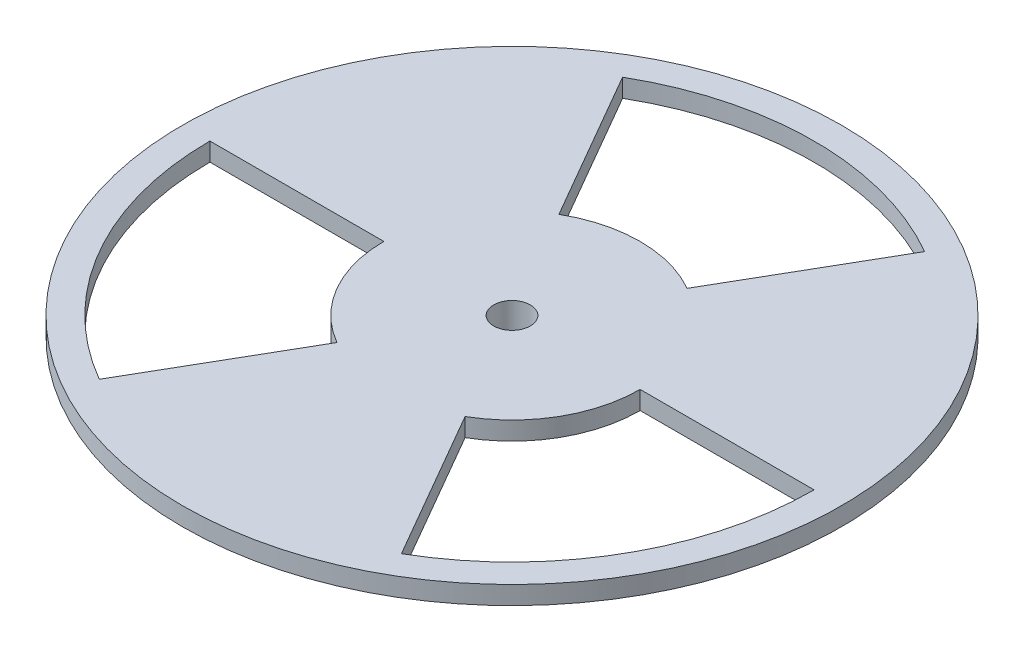
ISO-10303-21;
HEADER;
FILE_DESCRIPTION(('STEP AP214'),'2;1');
FILE_NAME('part.step','',(''),(''),'','','');
FILE_SCHEMA(('AUTOMOTIVE_DESIGN { 1 0 10303 214 1 1 1 1 }'));
ENDSEC;
DATA;
#1=APPLICATION_CONTEXT('core data for automotive mechanical design processes');
#2=APPLICATION_PROTOCOL_DEFINITION('international standard','automotive_design',2000,#1);
#3=PRODUCT_CONTEXT('',#1,'mechanical');
#4=PRODUCT('Part','Part','',(#3));
#5=PRODUCT_RELATED_PRODUCT_CATEGORY('part','',(#4));
#6=PRODUCT_DEFINITION_FORMATION('','',#4);
#7=PRODUCT_DEFINITION_CONTEXT('part definition',#1,'design');
#8=PRODUCT_DEFINITION('design','',#6,#7);
#9=PRODUCT_DEFINITION_SHAPE('','',#8);
#10=(LENGTH_UNIT() NAMED_UNIT(*) SI_UNIT(.MILLI.,.METRE.));
#11=(NAMED_UNIT(*) PLANE_ANGLE_UNIT() SI_UNIT($,.RADIAN.));
#12=(NAMED_UNIT(*) SI_UNIT($,.STERADIAN.) SOLID_ANGLE_UNIT());
#13=UNCERTAINTY_MEASURE_WITH_UNIT(LENGTH_MEASURE(1.E-05),#10,'distance_accuracy_value','');
#14=(GEOMETRIC_REPRESENTATION_CONTEXT(3) GLOBAL_UNCERTAINTY_ASSIGNED_CONTEXT((#13)) GLOBAL_UNIT_ASSIGNED_CONTEXT((#10,
#11,#12)) REPRESENTATION_CONTEXT('',''));
#15=CARTESIAN_POINT('',(0.,0.,0.));
#16=DIRECTION('',(0.,0.,1.));
#17=DIRECTION('',(1.,0.,0.));
#18=AXIS2_PLACEMENT_3D('',#15,#16,#17);
#19=CARTESIAN_POINT('',(0.,1.,0.));
#20=DIRECTION('',(0.,-1.,0.));
#21=DIRECTION('',(0.,0.,-1.));
#22=AXIS2_PLACEMENT_3D('',#19,#20,#21);
#23=CYLINDRICAL_SURFACE('',#22,18.);
#24=CARTESIAN_POINT('',(0.,1.,0.));
#25=DIRECTION('',(0.,1.,0.));
#26=DIRECTION('',(0.,0.,1.));
#27=AXIS2_PLACEMENT_3D('',#24,#25,#26);
#28=CIRCLE('',#27,18.);
#29=CARTESIAN_POINT('',(0.,1.,18.));
#30=VERTEX_POINT('',#29);
#31=EDGE_CURVE('E46',#30,#30,#28,.T.);
#32=ORIENTED_EDGE('',*,*,#31,.F.);
#33=EDGE_LOOP('',(#32));
#34=FACE_BOUND('',#33,.T.);
#35=CARTESIAN_POINT('',(0.,0.,0.));
#36=DIRECTION('',(0.,1.,0.));
#37=DIRECTION('',(0.,0.,1.));
#38=AXIS2_PLACEMENT_3D('',#35,#36,#37);
#39=CIRCLE('',#38,18.);
#40=CARTESIAN_POINT('',(0.,0.,18.));
#41=VERTEX_POINT('',#40);
#42=EDGE_CURVE('E273',#41,#41,#39,.T.);
#43=ORIENTED_EDGE('',*,*,#42,.T.);
#44=EDGE_LOOP('',(#43));
#45=FACE_BOUND('',#44,.T.);
#46=ADVANCED_FACE('F38',(#34,#45),#23,.T.);
#47=CARTESIAN_POINT('',(0.,1.,0.));
#48=DIRECTION('',(0.,1.,0.));
#49=DIRECTION('',(0.,0.,1.));
#50=AXIS2_PLACEMENT_3D('',#47,#48,#49);
#51=PLANE('',#50);
#52=CARTESIAN_POINT('',(0.,1.,0.));
#53=DIRECTION('',(0.,1.,0.));
#54=DIRECTION('',(0.,0.,-1.));
#55=AXIS2_PLACEMENT_3D('',#52,#53,#54);
#56=CIRCLE('',#55,16.5);
#57=CARTESIAN_POINT('',(8.25000000000002,1.,-14.2894191624432));
#58=VERTEX_POINT('',#57);
#59=CARTESIAN_POINT('',(-8.25000000000002,1.,-14.2894191624432));
#60=VERTEX_POINT('',#59);
#61=EDGE_CURVE('E53',#58,#60,#56,.T.);
#62=ORIENTED_EDGE('',*,*,#61,.F.);
#63=DIRECTION('',(0.500000000000001,0.,-0.866025403784438));
#64=VECTOR('',#63,1.);
#65=CARTESIAN_POINT('',(3.50000000000001,1.,-6.06217782649107));
#66=LINE('',#65,#64);
#67=CARTESIAN_POINT('',(3.50000000000001,1.,-6.06217782649107));
#68=VERTEX_POINT('',#67);
#69=EDGE_CURVE('E136',#68,#58,#66,.T.);
#70=ORIENTED_EDGE('',*,*,#69,.F.);
#71=CARTESIAN_POINT('',(0.,1.,0.));
#72=DIRECTION('',(0.,-1.,0.));
#73=DIRECTION('',(0.,0.,-1.));
#74=AXIS2_PLACEMENT_3D('',#71,#72,#73);
#75=CIRCLE('',#74,7.);
#76=CARTESIAN_POINT('',(-3.50000000000001,1.,-6.06217782649107));
#77=VERTEX_POINT('',#76);
#78=EDGE_CURVE('E164',#77,#68,#75,.T.);
#79=ORIENTED_EDGE('',*,*,#78,.F.);
#80=DIRECTION('',(0.500000000000001,0.,0.866025403784438));
#81=VECTOR('',#80,1.);
#82=CARTESIAN_POINT('',(-3.50000000000001,1.,-6.06217782649107));
#83=LINE('',#82,#81);
#84=EDGE_CURVE('E156',#60,#77,#83,.T.);
#85=ORIENTED_EDGE('',*,*,#84,.F.);
#86=EDGE_LOOP('',(#62,#70,#79,#85));
#87=FACE_BOUND('',#86,.T.);
#88=CARTESIAN_POINT('',(0.,1.,0.));
#89=DIRECTION('',(0.,1.,0.));
#90=DIRECTION('',(0.,0.,-1.));
#91=AXIS2_PLACEMENT_3D('',#88,#89,#90);
#92=CIRCLE('',#91,16.5);
#93=CARTESIAN_POINT('',(8.24999999999991,1.,14.2894191624433));
#94=VERTEX_POINT('',#93);
#95=CARTESIAN_POINT('',(16.5,1.,0.));
#96=VERTEX_POINT('',#95);
#97=EDGE_CURVE('E61',#94,#96,#92,.T.);
#98=ORIENTED_EDGE('',*,*,#97,.F.);
#99=DIRECTION('',(0.499999999999995,0.,0.866025403784442));
#100=VECTOR('',#99,1.);
#101=CARTESIAN_POINT('',(3.49999999999996,1.,6.06217782649109));
#102=LINE('',#101,#100);
#103=CARTESIAN_POINT('',(3.49999999999996,1.,6.06217782649109));
#104=VERTEX_POINT('',#103);
#105=EDGE_CURVE('E200',#104,#94,#102,.T.);
#106=ORIENTED_EDGE('',*,*,#105,.F.);
#107=CARTESIAN_POINT('',(0.,1.,0.));
#108=DIRECTION('',(0.,-1.,0.));
#109=DIRECTION('',(0.,0.,-1.));
#110=AXIS2_PLACEMENT_3D('',#107,#108,#109);
#111=CIRCLE('',#110,7.);
#112=CARTESIAN_POINT('',(7.,1.,0.));
#113=VERTEX_POINT('',#112);
#114=EDGE_CURVE('E196',#113,#104,#111,.T.);
#115=ORIENTED_EDGE('',*,*,#114,.F.);
#116=DIRECTION('',(-1.,0.,0.));
#117=VECTOR('',#116,1.);
#118=CARTESIAN_POINT('',(7.,1.,0.));
#119=LINE('',#118,#117);
#120=EDGE_CURVE('E192',#96,#113,#119,.T.);
#121=ORIENTED_EDGE('',*,*,#120,.F.);
#122=EDGE_LOOP('',(#98,#106,#115,#121));
#123=FACE_BOUND('',#122,.T.);
#124=CARTESIAN_POINT('',(0.,1.,0.));
#125=DIRECTION('',(0.,1.,0.));
#126=DIRECTION('',(0.,0.,-1.));
#127=AXIS2_PLACEMENT_3D('',#124,#125,#126);
#128=CIRCLE('',#127,16.5);
#129=CARTESIAN_POINT('',(-16.5,1.,-1.72604985859692E-13));
#130=VERTEX_POINT('',#129);
#131=CARTESIAN_POINT('',(-8.25000000000012,1.,14.2894191624432));
#132=VERTEX_POINT('',#131);
#133=EDGE_CURVE('E231',#130,#132,#128,.T.);
#134=ORIENTED_EDGE('',*,*,#133,.F.);
#135=DIRECTION('',(-1.,0.,0.));
#136=VECTOR('',#135,1.);
#137=CARTESIAN_POINT('',(-7.,1.,0.));
#138=LINE('',#137,#136);
#139=CARTESIAN_POINT('',(-7.,1.,0.));
#140=VERTEX_POINT('',#139);
#141=EDGE_CURVE('E242',#140,#130,#138,.T.);
#142=ORIENTED_EDGE('',*,*,#141,.F.);
#143=CARTESIAN_POINT('',(0.,1.,0.));
#144=DIRECTION('',(0.,-1.,0.));
#145=DIRECTION('',(0.,0.,-1.));
#146=AXIS2_PLACEMENT_3D('',#143,#144,#145);
#147=CIRCLE('',#146,7.);
#148=CARTESIAN_POINT('',(-3.50000000000005,1.,6.06217782649104));
#149=VERTEX_POINT('',#148);
#150=EDGE_CURVE('E238',#149,#140,#147,.T.);
#151=ORIENTED_EDGE('',*,*,#150,.F.);
#152=DIRECTION('',(0.500000000000007,0.,-0.866025403784435));
#153=VECTOR('',#152,1.);
#154=CARTESIAN_POINT('',(-3.50000000000005,1.,6.06217782649104));
#155=LINE('',#154,#153);
#156=EDGE_CURVE('E234',#132,#149,#155,.T.);
#157=ORIENTED_EDGE('',*,*,#156,.F.);
#158=EDGE_LOOP('',(#134,#142,#151,#157));
#159=FACE_BOUND('',#158,.T.);
#160=CARTESIAN_POINT('',(0.,1.,0.));
#161=DIRECTION('',(0.,-1.,0.));
#162=DIRECTION('',(0.,0.,-1.));
#163=AXIS2_PLACEMENT_3D('',#160,#161,#162);
#164=CIRCLE('',#163,1.);
#165=CARTESIAN_POINT('',(0.,1.,-1.));
#166=VERTEX_POINT('',#165);
#167=EDGE_CURVE('E262',#166,#166,#164,.T.);
#168=ORIENTED_EDGE('',*,*,#167,.T.);
#169=EDGE_LOOP('',(#168));
#170=FACE_BOUND('',#169,.T.);
#171=ORIENTED_EDGE('',*,*,#31,.T.);
#172=EDGE_LOOP('',(#171));
#173=FACE_BOUND('',#172,.T.);
#174=ADVANCED_FACE('F283',(#87,#123,#159,#170,#173),#51,.T.);
#175=CARTESIAN_POINT('',(0.,0.,0.));
#176=DIRECTION('',(0.,1.,0.));
#177=DIRECTION('',(0.,0.,1.));
#178=AXIS2_PLACEMENT_3D('',#175,#176,#177);
#179=PLANE('',#178);
#180=DIRECTION('',(-0.500000000000001,0.,0.866025403784438));
#181=VECTOR('',#180,1.);
#182=CARTESIAN_POINT('',(3.50000000000001,0.,-6.06217782649107));
#183=LINE('',#182,#181);
#184=CARTESIAN_POINT('',(8.25000000000002,0.,-14.2894191624432));
#185=VERTEX_POINT('',#184);
#186=CARTESIAN_POINT('',(3.50000000000001,0.,-6.06217782649107));
#187=VERTEX_POINT('',#186);
#188=EDGE_CURVE('E151',#185,#187,#183,.T.);
#189=ORIENTED_EDGE('',*,*,#188,.F.);
#190=CARTESIAN_POINT('',(0.,0.,0.));
#191=DIRECTION('',(0.,1.,0.));
#192=DIRECTION('',(0.,0.,1.));
#193=AXIS2_PLACEMENT_3D('',#190,#191,#192);
#194=CIRCLE('',#193,16.5);
#195=CARTESIAN_POINT('',(-8.25000000000002,0.,-14.2894191624432));
#196=VERTEX_POINT('',#195);
#197=EDGE_CURVE('E129',#196,#185,#194,.F.);
#198=ORIENTED_EDGE('',*,*,#197,.F.);
#199=DIRECTION('',(-0.500000000000001,0.,-0.866025403784438));
#200=VECTOR('',#199,1.);
#201=CARTESIAN_POINT('',(-3.50000000000001,0.,-6.06217782649107));
#202=LINE('',#201,#200);
#203=CARTESIAN_POINT('',(-3.50000000000001,0.,-6.06217782649107));
#204=VERTEX_POINT('',#203);
#205=EDGE_CURVE('E140',#204,#196,#202,.T.);
#206=ORIENTED_EDGE('',*,*,#205,.F.);
#207=CARTESIAN_POINT('',(0.,0.,0.));
#208=DIRECTION('',(0.,1.,0.));
#209=DIRECTION('',(0.,0.,1.));
#210=AXIS2_PLACEMENT_3D('',#207,#208,#209);
#211=CIRCLE('',#210,7.);
#212=EDGE_CURVE('E158',#187,#204,#211,.T.);
#213=ORIENTED_EDGE('',*,*,#212,.F.);
#214=EDGE_LOOP('',(#189,#198,#206,#213));
#215=FACE_BOUND('',#214,.T.);
#216=DIRECTION('',(-0.499999999999995,0.,-0.866025403784442));
#217=VECTOR('',#216,1.);
#218=CARTESIAN_POINT('',(3.49999999999996,0.,6.06217782649109));
#219=LINE('',#218,#217);
#220=CARTESIAN_POINT('',(8.24999999999991,0.,14.2894191624433));
#221=VERTEX_POINT('',#220);
#222=CARTESIAN_POINT('',(3.49999999999996,0.,6.06217782649109));
#223=VERTEX_POINT('',#222);
#224=EDGE_CURVE('E181',#221,#223,#219,.T.);
#225=ORIENTED_EDGE('',*,*,#224,.F.);
#226=CARTESIAN_POINT('',(0.,0.,0.));
#227=DIRECTION('',(0.,1.,0.));
#228=DIRECTION('',(0.,0.,1.));
#229=AXIS2_PLACEMENT_3D('',#226,#227,#228);
#230=CIRCLE('',#229,16.5);
#231=CARTESIAN_POINT('',(16.5,0.,0.));
#232=VERTEX_POINT('',#231);
#233=EDGE_CURVE('E186',#232,#221,#230,.F.);
#234=ORIENTED_EDGE('',*,*,#233,.F.);
#235=DIRECTION('',(1.,0.,0.));
#236=VECTOR('',#235,1.);
#237=CARTESIAN_POINT('',(7.,0.,0.));
#238=LINE('',#237,#236);
#239=CARTESIAN_POINT('',(7.,0.,0.));
#240=VERTEX_POINT('',#239);
#241=EDGE_CURVE('E208',#240,#232,#238,.T.);
#242=ORIENTED_EDGE('',*,*,#241,.F.);
#243=CARTESIAN_POINT('',(0.,0.,0.));
#244=DIRECTION('',(0.,1.,0.));
#245=DIRECTION('',(0.,0.,1.));
#246=AXIS2_PLACEMENT_3D('',#243,#244,#245);
#247=CIRCLE('',#246,7.);
#248=EDGE_CURVE('E178',#223,#240,#247,.T.);
#249=ORIENTED_EDGE('',*,*,#248,.F.);
#250=EDGE_LOOP('',(#225,#234,#242,#249));
#251=FACE_BOUND('',#250,.T.);
#252=DIRECTION('',(1.,0.,0.));
#253=VECTOR('',#252,1.);
#254=CARTESIAN_POINT('',(-7.,0.,0.));
#255=LINE('',#254,#253);
#256=CARTESIAN_POINT('',(-16.5,0.,-1.72604985859692E-13));
#257=VERTEX_POINT('',#256);
#258=CARTESIAN_POINT('',(-7.,0.,0.));
#259=VERTEX_POINT('',#258);
#260=EDGE_CURVE('E223',#257,#259,#255,.T.);
#261=ORIENTED_EDGE('',*,*,#260,.F.);
#262=CARTESIAN_POINT('',(0.,0.,0.));
#263=DIRECTION('',(0.,1.,0.));
#264=DIRECTION('',(0.,0.,1.));
#265=AXIS2_PLACEMENT_3D('',#262,#263,#264);
#266=CIRCLE('',#265,16.5);
#267=CARTESIAN_POINT('',(-8.25000000000011,0.,14.2894191624432));
#268=VERTEX_POINT('',#267);
#269=EDGE_CURVE('E227',#268,#257,#266,.F.);
#270=ORIENTED_EDGE('',*,*,#269,.F.);
#271=DIRECTION('',(-0.500000000000007,0.,0.866025403784435));
#272=VECTOR('',#271,1.);
#273=CARTESIAN_POINT('',(-3.50000000000005,0.,6.06217782649104));
#274=LINE('',#273,#272);
#275=CARTESIAN_POINT('',(-3.50000000000005,0.,6.06217782649104));
#276=VERTEX_POINT('',#275);
#277=EDGE_CURVE('E182',#276,#268,#274,.T.);
#278=ORIENTED_EDGE('',*,*,#277,.F.);
#279=CARTESIAN_POINT('',(0.,0.,0.));
#280=DIRECTION('',(0.,1.,0.));
#281=DIRECTION('',(0.,0.,1.));
#282=AXIS2_PLACEMENT_3D('',#279,#280,#281);
#283=CIRCLE('',#282,7.);
#284=EDGE_CURVE('E220',#259,#276,#283,.T.);
#285=ORIENTED_EDGE('',*,*,#284,.F.);
#286=EDGE_LOOP('',(#261,#270,#278,#285));
#287=FACE_BOUND('',#286,.T.);
#288=CARTESIAN_POINT('',(0.,0.,0.));
#289=DIRECTION('',(0.,1.,0.));
#290=DIRECTION('',(0.,0.,1.));
#291=AXIS2_PLACEMENT_3D('',#288,#289,#290);
#292=CIRCLE('',#291,2.);
#293=CARTESIAN_POINT('',(0.,0.,2.));
#294=VERTEX_POINT('',#293);
#295=EDGE_CURVE('E11',#294,#294,#292,.F.);
#296=ORIENTED_EDGE('',*,*,#295,.F.);
#297=EDGE_LOOP('',(#296));
#298=FACE_BOUND('',#297,.T.);
#299=ORIENTED_EDGE('',*,*,#42,.F.);
#300=EDGE_LOOP('',(#299));
#301=FACE_BOUND('',#300,.T.);
#302=ADVANCED_FACE('F148',(#215,#251,#287,#298,#301),#179,.F.);
#303=CARTESIAN_POINT('',(0.,-2.,0.));
#304=DIRECTION('',(0.,1.,0.));
#305=DIRECTION('',(0.,0.,1.));
#306=AXIS2_PLACEMENT_3D('',#303,#304,#305);
#307=CYLINDRICAL_SURFACE('',#306,2.);
#308=CARTESIAN_POINT('',(0.,-2.,0.));
#309=DIRECTION('',(0.,-1.,0.));
#310=DIRECTION('',(0.,0.,-1.));
#311=AXIS2_PLACEMENT_3D('',#308,#309,#310);
#312=CIRCLE('',#311,2.);
#313=CARTESIAN_POINT('',(0.,-2.,-2.));
#314=VERTEX_POINT('',#313);
#315=EDGE_CURVE('E266',#314,#314,#312,.T.);
#316=ORIENTED_EDGE('',*,*,#315,.F.);
#317=EDGE_LOOP('',(#316));
#318=FACE_BOUND('',#317,.T.);
#319=ORIENTED_EDGE('',*,*,#295,.T.);
#320=EDGE_LOOP('',(#319));
#321=FACE_BOUND('',#320,.T.);
#322=ADVANCED_FACE('F282',(#318,#321),#307,.T.);
#323=CARTESIAN_POINT('',(0.,-2.,0.));
#324=DIRECTION('',(0.,-1.,0.));
#325=DIRECTION('',(0.,0.,-1.));
#326=AXIS2_PLACEMENT_3D('',#323,#324,#325);
#327=PLANE('',#326);
#328=CARTESIAN_POINT('',(0.,-2.,0.));
#329=DIRECTION('',(0.,-1.,0.));
#330=DIRECTION('',(0.,0.,-1.));
#331=AXIS2_PLACEMENT_3D('',#328,#329,#330);
#332=CIRCLE('',#331,1.);
#333=CARTESIAN_POINT('',(0.,-2.,-1.));
#334=VERTEX_POINT('',#333);
#335=EDGE_CURVE('E145',#334,#334,#332,.T.);
#336=ORIENTED_EDGE('',*,*,#335,.F.);
#337=EDGE_LOOP('',(#336));
#338=FACE_BOUND('',#337,.T.);
#339=ORIENTED_EDGE('',*,*,#315,.T.);
#340=EDGE_LOOP('',(#339));
#341=FACE_BOUND('',#340,.T.);
#342=ADVANCED_FACE('F289',(#338,#341),#327,.T.);
#343=CARTESIAN_POINT('',(0.,1.,0.));
#344=DIRECTION('',(0.,-1.,0.));
#345=DIRECTION('',(0.,0.,-1.));
#346=AXIS2_PLACEMENT_3D('',#343,#344,#345);
#347=CYLINDRICAL_SURFACE('',#346,1.);
#348=ORIENTED_EDGE('',*,*,#167,.F.);
#349=EDGE_LOOP('',(#348));
#350=FACE_BOUND('',#349,.T.);
#351=ORIENTED_EDGE('',*,*,#335,.T.);
#352=EDGE_LOOP('',(#351));
#353=FACE_BOUND('',#352,.T.);
#354=ADVANCED_FACE('F321',(#350,#353),#347,.F.);
#355=CARTESIAN_POINT('',(0.,-2.001,0.));
#356=DIRECTION('',(0.,1.,0.));
#357=DIRECTION('',(0.,0.,1.));
#358=AXIS2_PLACEMENT_3D('',#355,#356,#357);
#359=CYLINDRICAL_SURFACE('',#358,16.5);
#360=ORIENTED_EDGE('',*,*,#269,.T.);
#361=DIRECTION('',(0.,1.,0.));
#362=VECTOR('',#361,1.);
#363=CARTESIAN_POINT('',(-16.5,-2.001,-1.72604985859692E-13));
#364=LINE('',#363,#362);
#365=EDGE_CURVE('E247',#257,#130,#364,.T.);
#366=ORIENTED_EDGE('',*,*,#365,.T.);
#367=ORIENTED_EDGE('',*,*,#133,.T.);
#368=DIRECTION('',(0.,1.,0.));
#369=VECTOR('',#368,1.);
#370=CARTESIAN_POINT('',(-8.25000000000011,-2.001,14.2894191624432));
#371=LINE('',#370,#369);
#372=EDGE_CURVE('E246',#268,#132,#371,.T.);
#373=ORIENTED_EDGE('',*,*,#372,.F.);
#374=EDGE_LOOP('',(#360,#366,#367,#373));
#375=FACE_BOUND('',#374,.T.);
#376=ADVANCED_FACE('F328',(#375),#359,.F.);
#377=CARTESIAN_POINT('',(-7.,-2.001,0.));
#378=DIRECTION('',(0.,0.,-1.));
#379=DIRECTION('',(-1.,0.,0.));
#380=AXIS2_PLACEMENT_3D('',#377,#378,#379);
#381=PLANE('',#380);
#382=ORIENTED_EDGE('',*,*,#260,.T.);
#383=DIRECTION('',(0.,1.,0.));
#384=VECTOR('',#383,1.);
#385=CARTESIAN_POINT('',(-7.,-2.001,0.));
#386=LINE('',#385,#384);
#387=EDGE_CURVE('E250',#259,#140,#386,.T.);
#388=ORIENTED_EDGE('',*,*,#387,.T.);
#389=ORIENTED_EDGE('',*,*,#141,.T.);
#390=ORIENTED_EDGE('',*,*,#365,.F.);
#391=EDGE_LOOP('',(#382,#388,#389,#390));
#392=FACE_BOUND('',#391,.T.);
#393=ADVANCED_FACE('F335',(#392),#381,.F.);
#394=CARTESIAN_POINT('',(0.,-2.001,0.));
#395=DIRECTION('',(0.,1.,0.));
#396=DIRECTION('',(0.,0.,1.));
#397=AXIS2_PLACEMENT_3D('',#394,#395,#396);
#398=CYLINDRICAL_SURFACE('',#397,7.);
#399=ORIENTED_EDGE('',*,*,#284,.T.);
#400=DIRECTION('',(0.,1.,0.));
#401=VECTOR('',#400,1.);
#402=CARTESIAN_POINT('',(-3.50000000000005,-2.001,6.06217782649104));
#403=LINE('',#402,#401);
#404=EDGE_CURVE('E253',#276,#149,#403,.T.);
#405=ORIENTED_EDGE('',*,*,#404,.T.);
#406=ORIENTED_EDGE('',*,*,#150,.T.);
#407=ORIENTED_EDGE('',*,*,#387,.F.);
#408=EDGE_LOOP('',(#399,#405,#406,#407));
#409=FACE_BOUND('',#408,.T.);
#410=ADVANCED_FACE('F343',(#409),#398,.T.);
#411=CARTESIAN_POINT('',(-3.50000000000005,-2.001,6.06217782649104));
#412=DIRECTION('',(0.866025403784435,0.,0.500000000000007));
#413=DIRECTION('',(0.500000000000007,0.,-0.866025403784435));
#414=AXIS2_PLACEMENT_3D('',#411,#412,#413);
#415=PLANE('',#414);
#416=ORIENTED_EDGE('',*,*,#277,.T.);
#417=ORIENTED_EDGE('',*,*,#372,.T.);
#418=ORIENTED_EDGE('',*,*,#156,.T.);
#419=ORIENTED_EDGE('',*,*,#404,.F.);
#420=EDGE_LOOP('',(#416,#417,#418,#419));
#421=FACE_BOUND('',#420,.T.);
#422=ADVANCED_FACE('F351',(#421),#415,.F.);
#423=CARTESIAN_POINT('',(0.,-2.001,0.));
#424=DIRECTION('',(0.,1.,0.));
#425=DIRECTION('',(0.,0.,1.));
#426=AXIS2_PLACEMENT_3D('',#423,#424,#425);
#427=CYLINDRICAL_SURFACE('',#426,16.5);
#428=ORIENTED_EDGE('',*,*,#233,.T.);
#429=DIRECTION('',(0.,1.,0.));
#430=VECTOR('',#429,1.);
#431=CARTESIAN_POINT('',(8.24999999999991,-2.001,14.2894191624433));
#432=LINE('',#431,#430);
#433=EDGE_CURVE('E205',#221,#94,#432,.T.);
#434=ORIENTED_EDGE('',*,*,#433,.T.);
#435=ORIENTED_EDGE('',*,*,#97,.T.);
#436=DIRECTION('',(0.,1.,0.));
#437=VECTOR('',#436,1.);
#438=CARTESIAN_POINT('',(16.5,-2.001,0.));
#439=LINE('',#438,#437);
#440=EDGE_CURVE('E204',#232,#96,#439,.T.);
#441=ORIENTED_EDGE('',*,*,#440,.F.);
#442=EDGE_LOOP('',(#428,#434,#435,#441));
#443=FACE_BOUND('',#442,.T.);
#444=ADVANCED_FACE('F359',(#443),#427,.F.);
#445=CARTESIAN_POINT('',(3.49999999999996,-2.001,6.06217782649109));
#446=DIRECTION('',(-0.866025403784442,0.,0.499999999999995));
#447=DIRECTION('',(0.499999999999995,0.,0.866025403784442));
#448=AXIS2_PLACEMENT_3D('',#445,#446,#447);
#449=PLANE('',#448);
#450=ORIENTED_EDGE('',*,*,#224,.T.);
#451=DIRECTION('',(0.,1.,0.));
#452=VECTOR('',#451,1.);
#453=CARTESIAN_POINT('',(3.49999999999996,-2.001,6.06217782649109));
#454=LINE('',#453,#452);
#455=EDGE_CURVE('E209',#223,#104,#454,.T.);
#456=ORIENTED_EDGE('',*,*,#455,.T.);
#457=ORIENTED_EDGE('',*,*,#105,.T.);
#458=ORIENTED_EDGE('',*,*,#433,.F.);
#459=EDGE_LOOP('',(#450,#456,#457,#458));
#460=FACE_BOUND('',#459,.T.);
#461=ADVANCED_FACE('F367',(#460),#449,.F.);
#462=CARTESIAN_POINT('',(0.,-2.001,0.));
#463=DIRECTION('',(0.,1.,0.));
#464=DIRECTION('',(0.,0.,1.));
#465=AXIS2_PLACEMENT_3D('',#462,#463,#464);
#466=CYLINDRICAL_SURFACE('',#465,7.);
#467=ORIENTED_EDGE('',*,*,#248,.T.);
#468=DIRECTION('',(0.,1.,0.));
#469=VECTOR('',#468,1.);
#470=CARTESIAN_POINT('',(7.,-2.001,0.));
#471=LINE('',#470,#469);
#472=EDGE_CURVE('E212',#240,#113,#471,.T.);
#473=ORIENTED_EDGE('',*,*,#472,.T.);
#474=ORIENTED_EDGE('',*,*,#114,.T.);
#475=ORIENTED_EDGE('',*,*,#455,.F.);
#476=EDGE_LOOP('',(#467,#473,#474,#475));
#477=FACE_BOUND('',#476,.T.);
#478=ADVANCED_FACE('F374',(#477),#466,.T.);
#479=CARTESIAN_POINT('',(7.,-2.001,0.));
#480=DIRECTION('',(0.,0.,-1.));
#481=DIRECTION('',(-1.,0.,0.));
#482=AXIS2_PLACEMENT_3D('',#479,#480,#481);
#483=PLANE('',#482);
#484=ORIENTED_EDGE('',*,*,#241,.T.);
#485=ORIENTED_EDGE('',*,*,#440,.T.);
#486=ORIENTED_EDGE('',*,*,#120,.T.);
#487=ORIENTED_EDGE('',*,*,#472,.F.);
#488=EDGE_LOOP('',(#484,#485,#486,#487));
#489=FACE_BOUND('',#488,.T.);
#490=ADVANCED_FACE('F382',(#489),#483,.F.);
#491=CARTESIAN_POINT('',(0.,-2.001,0.));
#492=DIRECTION('',(0.,1.,0.));
#493=DIRECTION('',(0.,0.,1.));
#494=AXIS2_PLACEMENT_3D('',#491,#492,#493);
#495=CYLINDRICAL_SURFACE('',#494,16.5);
#496=ORIENTED_EDGE('',*,*,#197,.T.);
#497=DIRECTION('',(0.,1.,0.));
#498=VECTOR('',#497,1.);
#499=CARTESIAN_POINT('',(8.25000000000002,-2.001,-14.2894191624432));
#500=LINE('',#499,#498);
#501=EDGE_CURVE('E146',#185,#58,#500,.T.);
#502=ORIENTED_EDGE('',*,*,#501,.T.);
#503=ORIENTED_EDGE('',*,*,#61,.T.);
#504=DIRECTION('',(0.,1.,0.));
#505=VECTOR('',#504,1.);
#506=CARTESIAN_POINT('',(-8.25000000000002,-2.001,-14.2894191624432));
#507=LINE('',#506,#505);
#508=EDGE_CURVE('E125',#196,#60,#507,.T.);
#509=ORIENTED_EDGE('',*,*,#508,.F.);
#510=EDGE_LOOP('',(#496,#502,#503,#509));
#511=FACE_BOUND('',#510,.T.);
#512=ADVANCED_FACE('F127',(#511),#495,.F.);
#513=CARTESIAN_POINT('',(3.50000000000001,-2.001,-6.06217782649107));
#514=DIRECTION('',(0.866025403784438,0.,0.500000000000001));
#515=DIRECTION('',(0.500000000000001,0.,-0.866025403784438));
#516=AXIS2_PLACEMENT_3D('',#513,#514,#515);
#517=PLANE('',#516);
#518=ORIENTED_EDGE('',*,*,#188,.T.);
#519=DIRECTION('',(0.,1.,0.));
#520=VECTOR('',#519,1.);
#521=CARTESIAN_POINT('',(3.50000000000001,-2.001,-6.06217782649107));
#522=LINE('',#521,#520);
#523=EDGE_CURVE('E173',#187,#68,#522,.T.);
#524=ORIENTED_EDGE('',*,*,#523,.T.);
#525=ORIENTED_EDGE('',*,*,#69,.T.);
#526=ORIENTED_EDGE('',*,*,#501,.F.);
#527=EDGE_LOOP('',(#518,#524,#525,#526));
#528=FACE_BOUND('',#527,.T.);
#529=ADVANCED_FACE('F397',(#528),#517,.F.);
#530=CARTESIAN_POINT('',(0.,-2.001,0.));
#531=DIRECTION('',(0.,1.,0.));
#532=DIRECTION('',(0.,0.,1.));
#533=AXIS2_PLACEMENT_3D('',#530,#531,#532);
#534=CYLINDRICAL_SURFACE('',#533,7.);
#535=ORIENTED_EDGE('',*,*,#212,.T.);
#536=DIRECTION('',(0.,1.,0.));
#537=VECTOR('',#536,1.);
#538=CARTESIAN_POINT('',(-3.50000000000001,-2.001,-6.06217782649107));
#539=LINE('',#538,#537);
#540=EDGE_CURVE('E135',#204,#77,#539,.T.);
#541=ORIENTED_EDGE('',*,*,#540,.T.);
#542=ORIENTED_EDGE('',*,*,#78,.T.);
#543=ORIENTED_EDGE('',*,*,#523,.F.);
#544=EDGE_LOOP('',(#535,#541,#542,#543));
#545=FACE_BOUND('',#544,.T.);
#546=ADVANCED_FACE('F404',(#545),#534,.T.);
#547=CARTESIAN_POINT('',(-3.50000000000001,-2.001,-6.06217782649107));
#548=DIRECTION('',(-0.866025403784438,0.,0.500000000000001));
#549=DIRECTION('',(0.500000000000001,0.,0.866025403784438));
#550=AXIS2_PLACEMENT_3D('',#547,#548,#549);
#551=PLANE('',#550);
#552=ORIENTED_EDGE('',*,*,#205,.T.);
#553=ORIENTED_EDGE('',*,*,#508,.T.);
#554=ORIENTED_EDGE('',*,*,#84,.T.);
#555=ORIENTED_EDGE('',*,*,#540,.F.);
#556=EDGE_LOOP('',(#552,#553,#554,#555));
#557=FACE_BOUND('',#556,.T.);
#558=ADVANCED_FACE('F141',(#557),#551,.F.);
#559=CLOSED_SHELL('',(#46,#174,#302,#322,#342,#354,#376,#393,#410,#422,#444,#461,#478,#490,#512,
#529,#546,#558));
#560=MANIFOLD_SOLID_BREP('B2',#559);
#561=ADVANCED_BREP_SHAPE_REPRESENTATION('',(#18,#560),#14);
#562=SHAPE_DEFINITION_REPRESENTATION(#9,#561);
ENDSEC;
END-ISO-10303-21;
